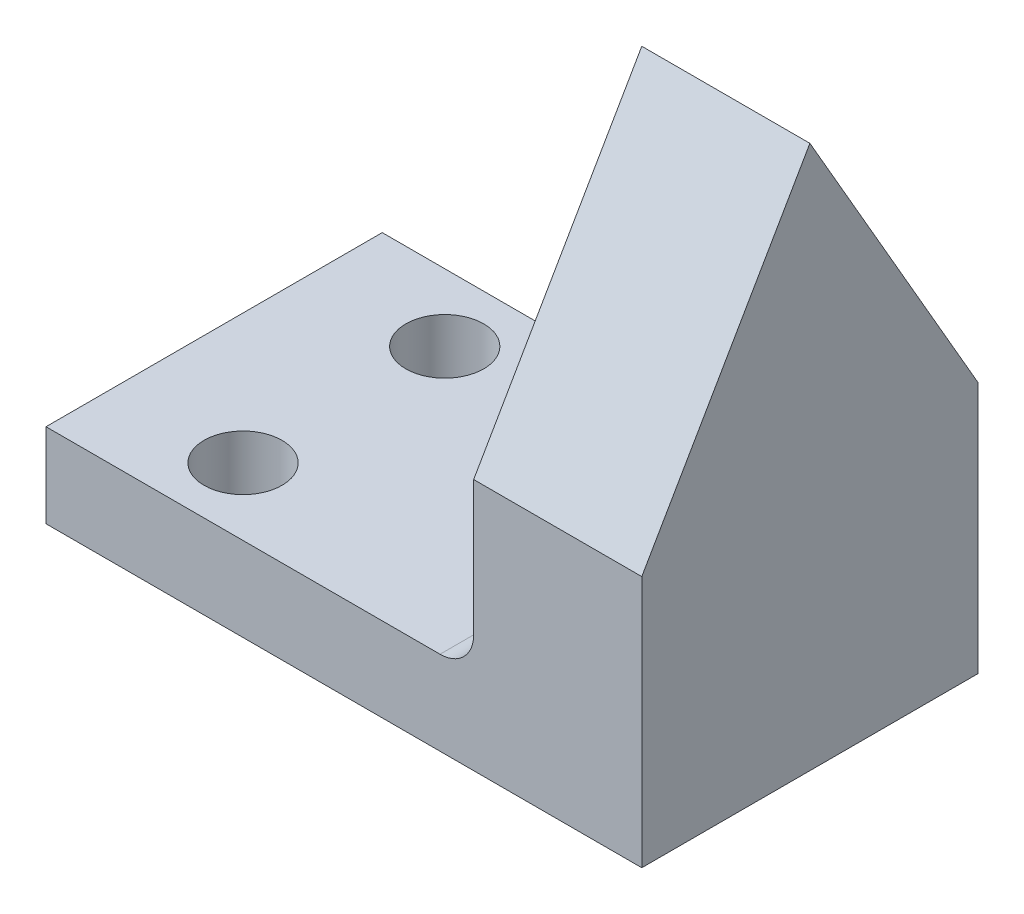
ISO-10303-21;
HEADER;
FILE_DESCRIPTION(('STEP AP214'),'2;1');
FILE_NAME('part.step','',(''),(''),'','','');
FILE_SCHEMA(('AUTOMOTIVE_DESIGN { 1 0 10303 214 1 1 1 1 }'));
ENDSEC;
DATA;
#1=APPLICATION_CONTEXT('core data for automotive mechanical design processes');
#2=APPLICATION_PROTOCOL_DEFINITION('international standard','automotive_design',2000,#1);
#3=PRODUCT_CONTEXT('',#1,'mechanical');
#4=PRODUCT('Part','Part','',(#3));
#5=PRODUCT_RELATED_PRODUCT_CATEGORY('part','',(#4));
#6=PRODUCT_DEFINITION_FORMATION('','',#4);
#7=PRODUCT_DEFINITION_CONTEXT('part definition',#1,'design');
#8=PRODUCT_DEFINITION('design','',#6,#7);
#9=PRODUCT_DEFINITION_SHAPE('','',#8);
#10=(LENGTH_UNIT() NAMED_UNIT(*) SI_UNIT(.MILLI.,.METRE.));
#11=(NAMED_UNIT(*) PLANE_ANGLE_UNIT() SI_UNIT($,.RADIAN.));
#12=(NAMED_UNIT(*) SI_UNIT($,.STERADIAN.) SOLID_ANGLE_UNIT());
#13=UNCERTAINTY_MEASURE_WITH_UNIT(LENGTH_MEASURE(1.E-05),#10,'distance_accuracy_value','');
#14=(GEOMETRIC_REPRESENTATION_CONTEXT(3) GLOBAL_UNCERTAINTY_ASSIGNED_CONTEXT((#13)) GLOBAL_UNIT_ASSIGNED_CONTEXT((#10,
#11,#12)) REPRESENTATION_CONTEXT('',''));
#15=CARTESIAN_POINT('',(0.,0.,0.));
#16=DIRECTION('',(0.,0.,1.));
#17=DIRECTION('',(1.,0.,0.));
#18=AXIS2_PLACEMENT_3D('',#15,#16,#17);
#19=CARTESIAN_POINT('',(0.,3.17500000000001,-6.35));
#20=DIRECTION('',(0.,0.,1.));
#21=DIRECTION('',(1.,0.,0.));
#22=AXIS2_PLACEMENT_3D('',#19,#20,#21);
#23=PLANE('',#22);
#24=DIRECTION('',(-1.,0.,0.));
#25=VECTOR('',#24,1.);
#26=CARTESIAN_POINT('',(0.,0.,-6.35));
#27=LINE('',#26,#25);
#28=CARTESIAN_POINT('',(7.93749999999999,0.,-6.35));
#29=VERTEX_POINT('',#28);
#30=CARTESIAN_POINT('',(-14.5669,0.,-6.35));
#31=VERTEX_POINT('',#30);
#32=EDGE_CURVE('E103',#29,#31,#27,.T.);
#33=ORIENTED_EDGE('',*,*,#32,.T.);
#34=DIRECTION('',(0.,-1.,0.));
#35=VECTOR('',#34,1.);
#36=CARTESIAN_POINT('',(-14.5669,3.17500000000001,-6.35));
#37=LINE('',#36,#35);
#38=CARTESIAN_POINT('',(-14.5669,3.17500000000001,-6.35));
#39=VERTEX_POINT('',#38);
#40=EDGE_CURVE('E106',#39,#31,#37,.T.);
#41=ORIENTED_EDGE('',*,*,#40,.F.);
#42=DIRECTION('',(-1.,0.,0.));
#43=VECTOR('',#42,1.);
#44=CARTESIAN_POINT('',(0.,3.17500000000001,-6.35));
#45=LINE('',#44,#43);
#46=CARTESIAN_POINT('',(0.317500000000026,3.17500000000001,-6.35));
#47=VERTEX_POINT('',#46);
#48=EDGE_CURVE('E159',#47,#39,#45,.T.);
#49=ORIENTED_EDGE('',*,*,#48,.F.);
#50=CARTESIAN_POINT('',(0.317500000000026,4.445,-6.35));
#51=DIRECTION('',(0.,0.,1.));
#52=DIRECTION('',(1.,0.,0.));
#53=AXIS2_PLACEMENT_3D('',#50,#51,#52);
#54=CIRCLE('',#53,1.27);
#55=CARTESIAN_POINT('',(1.58750000000002,4.445,-6.35));
#56=VERTEX_POINT('',#55);
#57=EDGE_CURVE('E11',#47,#56,#54,.T.);
#58=ORIENTED_EDGE('',*,*,#57,.T.);
#59=DIRECTION('',(0.,1.,0.));
#60=VECTOR('',#59,1.);
#61=CARTESIAN_POINT('',(1.58750000000002,0.,-6.35));
#62=LINE('',#61,#60);
#63=CARTESIAN_POINT('',(1.58750000000002,9.52499999999998,-6.35));
#64=VERTEX_POINT('',#63);
#65=EDGE_CURVE('E136',#56,#64,#62,.T.);
#66=ORIENTED_EDGE('',*,*,#65,.T.);
#67=DIRECTION('',(1.,0.,0.));
#68=VECTOR('',#67,1.);
#69=CARTESIAN_POINT('',(1.58750000000002,9.52499999999998,-6.35));
#70=LINE('',#69,#68);
#71=CARTESIAN_POINT('',(7.93749999999999,9.52499999999998,-6.35));
#72=VERTEX_POINT('',#71);
#73=EDGE_CURVE('E150',#64,#72,#70,.T.);
#74=ORIENTED_EDGE('',*,*,#73,.T.);
#75=DIRECTION('',(0.,-1.,0.));
#76=VECTOR('',#75,1.);
#77=CARTESIAN_POINT('',(7.93749999999999,3.17500000000001,-6.35));
#78=LINE('',#77,#76);
#79=EDGE_CURVE('E108',#72,#29,#78,.T.);
#80=ORIENTED_EDGE('',*,*,#79,.T.);
#81=EDGE_LOOP('',(#33,#41,#49,#58,#66,#74,#80));
#82=FACE_BOUND('',#81,.T.);
#83=ADVANCED_FACE('F39',(#82),#23,.F.);
#84=CARTESIAN_POINT('',(0.,3.17500000000001,6.35));
#85=DIRECTION('',(0.,0.,1.));
#86=DIRECTION('',(1.,0.,0.));
#87=AXIS2_PLACEMENT_3D('',#84,#85,#86);
#88=PLANE('',#87);
#89=DIRECTION('',(-1.,0.,0.));
#90=VECTOR('',#89,1.);
#91=CARTESIAN_POINT('',(0.,0.,6.35));
#92=LINE('',#91,#90);
#93=CARTESIAN_POINT('',(7.93749999999999,0.,6.35));
#94=VERTEX_POINT('',#93);
#95=CARTESIAN_POINT('',(-14.5669,0.,6.35));
#96=VERTEX_POINT('',#95);
#97=EDGE_CURVE('E111',#94,#96,#92,.T.);
#98=ORIENTED_EDGE('',*,*,#97,.F.);
#99=DIRECTION('',(0.,-1.,0.));
#100=VECTOR('',#99,1.);
#101=CARTESIAN_POINT('',(7.93749999999999,3.17500000000001,6.35));
#102=LINE('',#101,#100);
#103=CARTESIAN_POINT('',(7.93749999999999,9.52499999999998,6.35));
#104=VERTEX_POINT('',#103);
#105=EDGE_CURVE('E172',#104,#94,#102,.T.);
#106=ORIENTED_EDGE('',*,*,#105,.F.);
#107=DIRECTION('',(1.,0.,0.));
#108=VECTOR('',#107,1.);
#109=CARTESIAN_POINT('',(1.58750000000002,9.52499999999998,6.35));
#110=LINE('',#109,#108);
#111=CARTESIAN_POINT('',(1.58750000000002,9.52499999999998,6.35));
#112=VERTEX_POINT('',#111);
#113=EDGE_CURVE('E143',#112,#104,#110,.T.);
#114=ORIENTED_EDGE('',*,*,#113,.F.);
#115=DIRECTION('',(0.,1.,0.));
#116=VECTOR('',#115,1.);
#117=CARTESIAN_POINT('',(1.58750000000002,0.,6.35));
#118=LINE('',#117,#116);
#119=CARTESIAN_POINT('',(1.58750000000002,4.445,6.35));
#120=VERTEX_POINT('',#119);
#121=EDGE_CURVE('E138',#120,#112,#118,.T.);
#122=ORIENTED_EDGE('',*,*,#121,.F.);
#123=CARTESIAN_POINT('',(0.317500000000026,4.445,6.35));
#124=DIRECTION('',(0.,0.,1.));
#125=DIRECTION('',(1.,0.,0.));
#126=AXIS2_PLACEMENT_3D('',#123,#124,#125);
#127=CIRCLE('',#126,1.27);
#128=CARTESIAN_POINT('',(0.317500000000026,3.17500000000001,6.35));
#129=VERTEX_POINT('',#128);
#130=EDGE_CURVE('E47',#120,#129,#127,.F.);
#131=ORIENTED_EDGE('',*,*,#130,.T.);
#132=DIRECTION('',(-1.,0.,0.));
#133=VECTOR('',#132,1.);
#134=CARTESIAN_POINT('',(0.,3.17500000000001,6.35));
#135=LINE('',#134,#133);
#136=CARTESIAN_POINT('',(-14.5669,3.17500000000001,6.35));
#137=VERTEX_POINT('',#136);
#138=EDGE_CURVE('E167',#129,#137,#135,.T.);
#139=ORIENTED_EDGE('',*,*,#138,.T.);
#140=DIRECTION('',(0.,1.,0.));
#141=VECTOR('',#140,1.);
#142=CARTESIAN_POINT('',(-14.5669,0.,6.35));
#143=LINE('',#142,#141);
#144=EDGE_CURVE('E121',#96,#137,#143,.T.);
#145=ORIENTED_EDGE('',*,*,#144,.F.);
#146=EDGE_LOOP('',(#98,#106,#114,#122,#131,#139,#145));
#147=FACE_BOUND('',#146,.T.);
#148=ADVANCED_FACE('F214',(#147),#88,.T.);
#149=CARTESIAN_POINT('',(-9.66470000000003,3.17500000000001,-3.81));
#150=DIRECTION('',(0.,-1.,0.));
#151=DIRECTION('',(0.,0.,-1.));
#152=AXIS2_PLACEMENT_3D('',#149,#150,#151);
#153=CYLINDRICAL_SURFACE('',#152,1.4732);
#154=CARTESIAN_POINT('',(-9.66470000000003,3.17500000000001,-3.81));
#155=DIRECTION('',(0.,1.,0.));
#156=DIRECTION('',(0.,0.,1.));
#157=AXIS2_PLACEMENT_3D('',#154,#155,#156);
#158=CIRCLE('',#157,1.4732);
#159=CARTESIAN_POINT('',(-9.66470000000003,3.17500000000001,-2.3368));
#160=VERTEX_POINT('',#159);
#161=EDGE_CURVE('E155',#160,#160,#158,.T.);
#162=ORIENTED_EDGE('',*,*,#161,.T.);
#163=EDGE_LOOP('',(#162));
#164=FACE_BOUND('',#163,.T.);
#165=CARTESIAN_POINT('',(-9.66470000000003,0.,-3.81));
#166=DIRECTION('',(0.,1.,0.));
#167=DIRECTION('',(0.,0.,1.));
#168=AXIS2_PLACEMENT_3D('',#165,#166,#167);
#169=CIRCLE('',#168,1.4732);
#170=CARTESIAN_POINT('',(-9.66470000000003,0.,-2.3368));
#171=VERTEX_POINT('',#170);
#172=EDGE_CURVE('E112',#171,#171,#169,.T.);
#173=ORIENTED_EDGE('',*,*,#172,.F.);
#174=EDGE_LOOP('',(#173));
#175=FACE_BOUND('',#174,.T.);
#176=ADVANCED_FACE('F206',(#164,#175),#153,.F.);
#177=CARTESIAN_POINT('',(-9.66470000000003,3.17500000000001,3.81));
#178=DIRECTION('',(0.,-1.,0.));
#179=DIRECTION('',(0.,0.,-1.));
#180=AXIS2_PLACEMENT_3D('',#177,#178,#179);
#181=CYLINDRICAL_SURFACE('',#180,1.4732);
#182=CARTESIAN_POINT('',(-9.66470000000003,3.17500000000001,3.81));
#183=DIRECTION('',(0.,1.,0.));
#184=DIRECTION('',(0.,0.,1.));
#185=AXIS2_PLACEMENT_3D('',#182,#183,#184);
#186=CIRCLE('',#185,1.4732);
#187=CARTESIAN_POINT('',(-9.66470000000003,3.17500000000001,5.2832));
#188=VERTEX_POINT('',#187);
#189=EDGE_CURVE('E152',#188,#188,#186,.T.);
#190=ORIENTED_EDGE('',*,*,#189,.T.);
#191=EDGE_LOOP('',(#190));
#192=FACE_BOUND('',#191,.T.);
#193=CARTESIAN_POINT('',(-9.66470000000003,0.,3.81));
#194=DIRECTION('',(0.,1.,0.));
#195=DIRECTION('',(0.,0.,1.));
#196=AXIS2_PLACEMENT_3D('',#193,#194,#195);
#197=CIRCLE('',#196,1.4732);
#198=CARTESIAN_POINT('',(-9.66470000000003,0.,5.2832));
#199=VERTEX_POINT('',#198);
#200=EDGE_CURVE('E146',#199,#199,#197,.T.);
#201=ORIENTED_EDGE('',*,*,#200,.F.);
#202=EDGE_LOOP('',(#201));
#203=FACE_BOUND('',#202,.T.);
#204=ADVANCED_FACE('F204',(#192,#203),#181,.F.);
#205=CARTESIAN_POINT('',(7.93749999999999,3.17500000000001,0.));
#206=DIRECTION('',(-1.,0.,0.));
#207=DIRECTION('',(0.,0.,1.));
#208=AXIS2_PLACEMENT_3D('',#205,#206,#207);
#209=PLANE('',#208);
#210=DIRECTION('',(0.,0.,-1.));
#211=VECTOR('',#210,1.);
#212=CARTESIAN_POINT('',(7.93749999999999,0.,0.));
#213=LINE('',#212,#211);
#214=EDGE_CURVE('E156',#94,#29,#213,.T.);
#215=ORIENTED_EDGE('',*,*,#214,.T.);
#216=ORIENTED_EDGE('',*,*,#79,.F.);
#217=DIRECTION('',(0.,-0.86602540378444,-0.499999999999998));
#218=VECTOR('',#217,1.);
#219=CARTESIAN_POINT('',(7.93749999999999,5.13088065701559,-8.88694598552339));
#220=LINE('',#219,#218);
#221=CARTESIAN_POINT('',(7.93749999999999,20.5235226280624,0.));
#222=VERTEX_POINT('',#221);
#223=EDGE_CURVE('E131',#222,#72,#220,.T.);
#224=ORIENTED_EDGE('',*,*,#223,.F.);
#225=DIRECTION('',(0.,0.86602540378444,-0.499999999999998));
#226=VECTOR('',#225,1.);
#227=CARTESIAN_POINT('',(7.93749999999999,5.13088065701556,8.88694598552339));
#228=LINE('',#227,#226);
#229=EDGE_CURVE('E141',#104,#222,#228,.T.);
#230=ORIENTED_EDGE('',*,*,#229,.F.);
#231=ORIENTED_EDGE('',*,*,#105,.T.);
#232=EDGE_LOOP('',(#215,#216,#224,#230,#231));
#233=FACE_BOUND('',#232,.T.);
#234=ADVANCED_FACE('F195',(#233),#209,.F.);
#235=CARTESIAN_POINT('',(0.,3.17500000000001,0.));
#236=DIRECTION('',(0.,1.,0.));
#237=DIRECTION('',(0.,0.,1.));
#238=AXIS2_PLACEMENT_3D('',#235,#236,#237);
#239=PLANE('',#238);
#240=ORIENTED_EDGE('',*,*,#138,.F.);
#241=DIRECTION('',(0.,0.,1.));
#242=VECTOR('',#241,1.);
#243=CARTESIAN_POINT('',(0.317500000000026,3.17500000000001,0.));
#244=LINE('',#243,#242);
#245=EDGE_CURVE('E60',#129,#47,#244,.F.);
#246=ORIENTED_EDGE('',*,*,#245,.T.);
#247=ORIENTED_EDGE('',*,*,#48,.T.);
#248=DIRECTION('',(0.,0.,-1.));
#249=VECTOR('',#248,1.);
#250=CARTESIAN_POINT('',(-14.5669,3.17500000000001,6.35));
#251=LINE('',#250,#249);
#252=EDGE_CURVE('E126',#137,#39,#251,.T.);
#253=ORIENTED_EDGE('',*,*,#252,.F.);
#254=EDGE_LOOP('',(#240,#246,#247,#253));
#255=FACE_BOUND('',#254,.T.);
#256=ORIENTED_EDGE('',*,*,#189,.F.);
#257=EDGE_LOOP('',(#256));
#258=FACE_BOUND('',#257,.T.);
#259=ORIENTED_EDGE('',*,*,#161,.F.);
#260=EDGE_LOOP('',(#259));
#261=FACE_BOUND('',#260,.T.);
#262=ADVANCED_FACE('F212',(#255,#258,#261),#239,.T.);
#263=CARTESIAN_POINT('',(0.,0.,0.));
#264=DIRECTION('',(0.,1.,0.));
#265=DIRECTION('',(0.,0.,1.));
#266=AXIS2_PLACEMENT_3D('',#263,#264,#265);
#267=PLANE('',#266);
#268=ORIENTED_EDGE('',*,*,#200,.T.);
#269=EDGE_LOOP('',(#268));
#270=FACE_BOUND('',#269,.T.);
#271=ORIENTED_EDGE('',*,*,#172,.T.);
#272=EDGE_LOOP('',(#271));
#273=FACE_BOUND('',#272,.T.);
#274=ORIENTED_EDGE('',*,*,#32,.F.);
#275=ORIENTED_EDGE('',*,*,#214,.F.);
#276=ORIENTED_EDGE('',*,*,#97,.T.);
#277=DIRECTION('',(0.,0.,1.));
#278=VECTOR('',#277,1.);
#279=CARTESIAN_POINT('',(-14.5669,0.,-6.35));
#280=LINE('',#279,#278);
#281=EDGE_CURVE('E115',#31,#96,#280,.T.);
#282=ORIENTED_EDGE('',*,*,#281,.F.);
#283=EDGE_LOOP('',(#274,#275,#276,#282));
#284=FACE_BOUND('',#283,.T.);
#285=ADVANCED_FACE('F116',(#270,#273,#284),#267,.F.);
#286=CARTESIAN_POINT('',(1.58750000000002,5.13088065701556,8.88694598552339));
#287=DIRECTION('',(0.,-0.499999999999998,-0.86602540378444));
#288=DIRECTION('',(0.,0.86602540378444,-0.499999999999998));
#289=AXIS2_PLACEMENT_3D('',#286,#287,#288);
#290=PLANE('',#289);
#291=ORIENTED_EDGE('',*,*,#229,.T.);
#292=DIRECTION('',(1.,0.,0.));
#293=VECTOR('',#292,1.);
#294=CARTESIAN_POINT('',(1.58750000000002,20.5235226280624,0.));
#295=LINE('',#294,#293);
#296=CARTESIAN_POINT('',(1.58750000000002,20.5235226280624,0.));
#297=VERTEX_POINT('',#296);
#298=EDGE_CURVE('E147',#297,#222,#295,.T.);
#299=ORIENTED_EDGE('',*,*,#298,.F.);
#300=DIRECTION('',(0.,0.86602540378444,-0.499999999999998));
#301=VECTOR('',#300,1.);
#302=CARTESIAN_POINT('',(1.58750000000002,5.13088065701556,8.88694598552339));
#303=LINE('',#302,#301);
#304=EDGE_CURVE('E135',#112,#297,#303,.T.);
#305=ORIENTED_EDGE('',*,*,#304,.F.);
#306=ORIENTED_EDGE('',*,*,#113,.T.);
#307=EDGE_LOOP('',(#291,#299,#305,#306));
#308=FACE_BOUND('',#307,.T.);
#309=ADVANCED_FACE('F226',(#308),#290,.F.);
#310=CARTESIAN_POINT('',(1.58750000000002,5.13088065701559,-8.88694598552339));
#311=DIRECTION('',(0.,-0.499999999999998,0.86602540378444));
#312=DIRECTION('',(0.,-0.86602540378444,-0.499999999999998));
#313=AXIS2_PLACEMENT_3D('',#310,#311,#312);
#314=PLANE('',#313);
#315=ORIENTED_EDGE('',*,*,#223,.T.);
#316=ORIENTED_EDGE('',*,*,#73,.F.);
#317=DIRECTION('',(0.,-0.86602540378444,-0.499999999999998));
#318=VECTOR('',#317,1.);
#319=CARTESIAN_POINT('',(1.58750000000002,5.13088065701559,-8.88694598552339));
#320=LINE('',#319,#318);
#321=EDGE_CURVE('E132',#297,#64,#320,.T.);
#322=ORIENTED_EDGE('',*,*,#321,.F.);
#323=ORIENTED_EDGE('',*,*,#298,.T.);
#324=EDGE_LOOP('',(#315,#316,#322,#323));
#325=FACE_BOUND('',#324,.T.);
#326=ADVANCED_FACE('F193',(#325),#314,.F.);
#327=CARTESIAN_POINT('',(1.58750000000002,0.,0.));
#328=DIRECTION('',(1.,0.,0.));
#329=DIRECTION('',(0.,0.,-1.));
#330=AXIS2_PLACEMENT_3D('',#327,#328,#329);
#331=PLANE('',#330);
#332=ORIENTED_EDGE('',*,*,#65,.F.);
#333=DIRECTION('',(0.,0.,1.));
#334=VECTOR('',#333,1.);
#335=CARTESIAN_POINT('',(1.58750000000002,4.445,0.));
#336=LINE('',#335,#334);
#337=EDGE_CURVE('E168',#56,#120,#336,.T.);
#338=ORIENTED_EDGE('',*,*,#337,.T.);
#339=ORIENTED_EDGE('',*,*,#121,.T.);
#340=ORIENTED_EDGE('',*,*,#304,.T.);
#341=ORIENTED_EDGE('',*,*,#321,.T.);
#342=EDGE_LOOP('',(#332,#338,#339,#340,#341));
#343=FACE_BOUND('',#342,.T.);
#344=ADVANCED_FACE('F189',(#343),#331,.F.);
#345=CARTESIAN_POINT('',(-14.5669,0.,0.));
#346=DIRECTION('',(-1.,0.,0.));
#347=DIRECTION('',(0.,0.,1.));
#348=AXIS2_PLACEMENT_3D('',#345,#346,#347);
#349=PLANE('',#348);
#350=ORIENTED_EDGE('',*,*,#40,.T.);
#351=ORIENTED_EDGE('',*,*,#281,.T.);
#352=ORIENTED_EDGE('',*,*,#144,.T.);
#353=ORIENTED_EDGE('',*,*,#252,.T.);
#354=EDGE_LOOP('',(#350,#351,#352,#353));
#355=FACE_BOUND('',#354,.T.);
#356=ADVANCED_FACE('F124',(#355),#349,.T.);
#357=CARTESIAN_POINT('',(0.317500000000026,4.445,0.));
#358=DIRECTION('',(0.,0.,1.));
#359=DIRECTION('',(1.,0.,0.));
#360=AXIS2_PLACEMENT_3D('',#357,#358,#359);
#361=CYLINDRICAL_SURFACE('',#360,1.27);
#362=ORIENTED_EDGE('',*,*,#57,.F.);
#363=ORIENTED_EDGE('',*,*,#245,.F.);
#364=ORIENTED_EDGE('',*,*,#130,.F.);
#365=ORIENTED_EDGE('',*,*,#337,.F.);
#366=EDGE_LOOP('',(#362,#363,#364,#365));
#367=FACE_BOUND('',#366,.T.);
#368=ADVANCED_FACE('F41',(#367),#361,.F.);
#369=CLOSED_SHELL('',(#83,#148,#176,#204,#234,#262,#285,#309,#326,#344,#356,#368));
#370=MANIFOLD_SOLID_BREP('B2',#369);
#371=ADVANCED_BREP_SHAPE_REPRESENTATION('',(#18,#370),#14);
#372=SHAPE_DEFINITION_REPRESENTATION(#9,#371);
ENDSEC;
END-ISO-10303-21;
